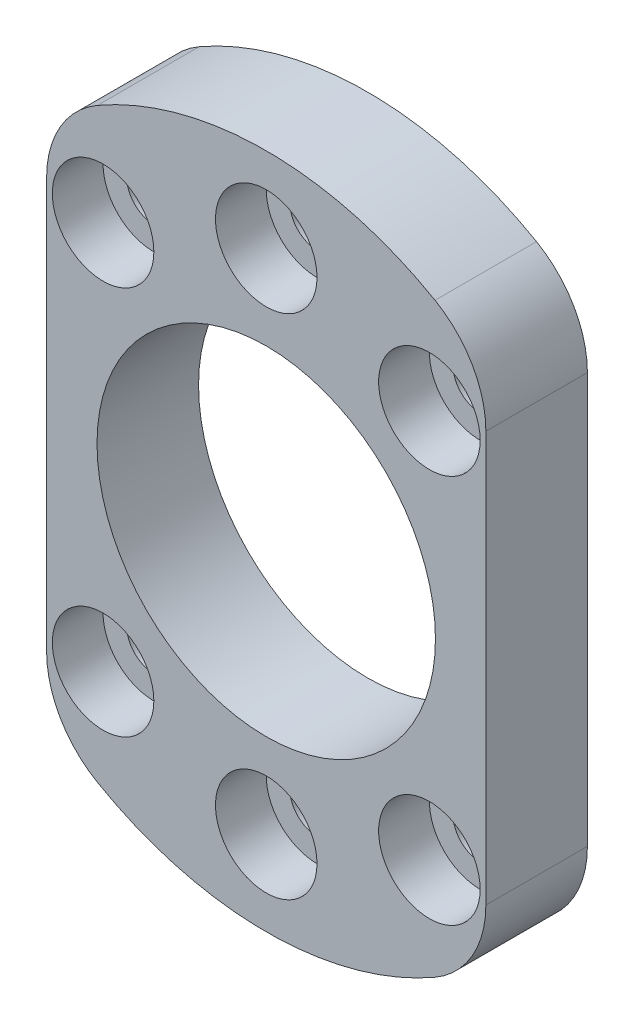
ISO-10303-21;
HEADER;
FILE_DESCRIPTION(('STEP AP214'),'2;1');
FILE_NAME('part.step','',(''),(''),'','','');
FILE_SCHEMA(('AUTOMOTIVE_DESIGN { 1 0 10303 214 1 1 1 1 }'));
ENDSEC;
DATA;
#1=APPLICATION_CONTEXT('core data for automotive mechanical design processes');
#2=APPLICATION_PROTOCOL_DEFINITION('international standard','automotive_design',2000,#1);
#3=PRODUCT_CONTEXT('',#1,'mechanical');
#4=PRODUCT('Part','Part','',(#3));
#5=PRODUCT_RELATED_PRODUCT_CATEGORY('part','',(#4));
#6=PRODUCT_DEFINITION_FORMATION('','',#4);
#7=PRODUCT_DEFINITION_CONTEXT('part definition',#1,'design');
#8=PRODUCT_DEFINITION('design','',#6,#7);
#9=PRODUCT_DEFINITION_SHAPE('','',#8);
#10=(LENGTH_UNIT() NAMED_UNIT(*) SI_UNIT(.MILLI.,.METRE.));
#11=(NAMED_UNIT(*) PLANE_ANGLE_UNIT() SI_UNIT($,.RADIAN.));
#12=(NAMED_UNIT(*) SI_UNIT($,.STERADIAN.) SOLID_ANGLE_UNIT());
#13=UNCERTAINTY_MEASURE_WITH_UNIT(LENGTH_MEASURE(1.E-05),#10,'distance_accuracy_value','');
#14=(GEOMETRIC_REPRESENTATION_CONTEXT(3) GLOBAL_UNCERTAINTY_ASSIGNED_CONTEXT((#13)) GLOBAL_UNIT_ASSIGNED_CONTEXT((#10,
#11,#12)) REPRESENTATION_CONTEXT('',''));
#15=CARTESIAN_POINT('',(0.,0.,0.));
#16=DIRECTION('',(0.,0.,1.));
#17=DIRECTION('',(1.,0.,0.));
#18=AXIS2_PLACEMENT_3D('',#15,#16,#17);
#19=CARTESIAN_POINT('',(9.64181414529811,-11.4906666467846,-1.));
#20=DIRECTION('',(0.,0.,1.));
#21=DIRECTION('',(1.,0.,0.));
#22=AXIS2_PLACEMENT_3D('',#19,#20,#21);
#23=CYLINDRICAL_SURFACE('',#22,1.6);
#24=CARTESIAN_POINT('',(9.64181414529811,-11.4906666467846,0.));
#25=DIRECTION('',(0.,0.,1.));
#26=DIRECTION('',(1.,0.,0.));
#27=AXIS2_PLACEMENT_3D('',#24,#25,#26);
#28=CIRCLE('',#27,1.6);
#29=CARTESIAN_POINT('',(11.2418141452981,-11.4906666467846,0.));
#30=VERTEX_POINT('',#29);
#31=EDGE_CURVE('E156',#30,#30,#28,.T.);
#32=ORIENTED_EDGE('',*,*,#31,.F.);
#33=EDGE_LOOP('',(#32));
#34=FACE_BOUND('',#33,.T.);
#35=CARTESIAN_POINT('',(9.64181414529811,-11.4906666467846,3.));
#36=DIRECTION('',(0.,0.,1.));
#37=DIRECTION('',(1.,0.,0.));
#38=AXIS2_PLACEMENT_3D('',#35,#36,#37);
#39=CIRCLE('',#38,1.6);
#40=CARTESIAN_POINT('',(11.2418141452981,-11.4906666467846,3.));
#41=VERTEX_POINT('',#40);
#42=EDGE_CURVE('E37',#41,#41,#39,.F.);
#43=ORIENTED_EDGE('',*,*,#42,.F.);
#44=EDGE_LOOP('',(#43));
#45=FACE_BOUND('',#44,.T.);
#46=ADVANCED_FACE('F33',(#34,#45),#23,.F.);
#47=CARTESIAN_POINT('',(0.,-15.,-1.));
#48=DIRECTION('',(0.,0.,1.));
#49=DIRECTION('',(1.,0.,0.));
#50=AXIS2_PLACEMENT_3D('',#47,#48,#49);
#51=CYLINDRICAL_SURFACE('',#50,1.6);
#52=CARTESIAN_POINT('',(0.,-15.,0.));
#53=DIRECTION('',(0.,0.,1.));
#54=DIRECTION('',(1.,0.,0.));
#55=AXIS2_PLACEMENT_3D('',#52,#53,#54);
#56=CIRCLE('',#55,1.6);
#57=CARTESIAN_POINT('',(1.6,-15.,0.));
#58=VERTEX_POINT('',#57);
#59=EDGE_CURVE('E153',#58,#58,#56,.T.);
#60=ORIENTED_EDGE('',*,*,#59,.F.);
#61=EDGE_LOOP('',(#60));
#62=FACE_BOUND('',#61,.T.);
#63=CARTESIAN_POINT('',(0.,-15.,3.));
#64=DIRECTION('',(0.,0.,1.));
#65=DIRECTION('',(1.,0.,0.));
#66=AXIS2_PLACEMENT_3D('',#63,#64,#65);
#67=CIRCLE('',#66,1.6);
#68=CARTESIAN_POINT('',(1.6,-15.,3.));
#69=VERTEX_POINT('',#68);
#70=EDGE_CURVE('E204',#69,#69,#67,.F.);
#71=ORIENTED_EDGE('',*,*,#70,.F.);
#72=EDGE_LOOP('',(#71));
#73=FACE_BOUND('',#72,.T.);
#74=ADVANCED_FACE('F260',(#62,#73),#51,.F.);
#75=CARTESIAN_POINT('',(-9.64181414529815,-11.4906666467846,-1.));
#76=DIRECTION('',(0.,0.,1.));
#77=DIRECTION('',(1.,0.,0.));
#78=AXIS2_PLACEMENT_3D('',#75,#76,#77);
#79=CYLINDRICAL_SURFACE('',#78,1.6);
#80=CARTESIAN_POINT('',(-9.64181414529815,-11.4906666467846,0.));
#81=DIRECTION('',(0.,0.,1.));
#82=DIRECTION('',(1.,0.,0.));
#83=AXIS2_PLACEMENT_3D('',#80,#81,#82);
#84=CIRCLE('',#83,1.6);
#85=CARTESIAN_POINT('',(-8.04181414529815,-11.4906666467846,0.));
#86=VERTEX_POINT('',#85);
#87=EDGE_CURVE('E150',#86,#86,#84,.T.);
#88=ORIENTED_EDGE('',*,*,#87,.F.);
#89=EDGE_LOOP('',(#88));
#90=FACE_BOUND('',#89,.T.);
#91=CARTESIAN_POINT('',(-9.64181414529815,-11.4906666467846,3.));
#92=DIRECTION('',(0.,0.,1.));
#93=DIRECTION('',(1.,0.,0.));
#94=AXIS2_PLACEMENT_3D('',#91,#92,#93);
#95=CIRCLE('',#94,1.6);
#96=CARTESIAN_POINT('',(-8.04181414529815,-11.4906666467846,3.));
#97=VERTEX_POINT('',#96);
#98=EDGE_CURVE('E200',#97,#97,#95,.F.);
#99=ORIENTED_EDGE('',*,*,#98,.F.);
#100=EDGE_LOOP('',(#99));
#101=FACE_BOUND('',#100,.T.);
#102=ADVANCED_FACE('F266',(#90,#101),#79,.F.);
#103=CARTESIAN_POINT('',(9.64181414529807,11.4906666467847,-1.));
#104=DIRECTION('',(0.,0.,1.));
#105=DIRECTION('',(1.,0.,0.));
#106=AXIS2_PLACEMENT_3D('',#103,#104,#105);
#107=CYLINDRICAL_SURFACE('',#106,1.6);
#108=CARTESIAN_POINT('',(9.64181414529807,11.4906666467847,0.));
#109=DIRECTION('',(0.,0.,1.));
#110=DIRECTION('',(1.,0.,0.));
#111=AXIS2_PLACEMENT_3D('',#108,#109,#110);
#112=CIRCLE('',#111,1.6);
#113=CARTESIAN_POINT('',(11.2418141452981,11.4906666467847,0.));
#114=VERTEX_POINT('',#113);
#115=EDGE_CURVE('E147',#114,#114,#112,.T.);
#116=ORIENTED_EDGE('',*,*,#115,.F.);
#117=EDGE_LOOP('',(#116));
#118=FACE_BOUND('',#117,.T.);
#119=CARTESIAN_POINT('',(9.64181414529807,11.4906666467847,3.));
#120=DIRECTION('',(0.,0.,1.));
#121=DIRECTION('',(1.,0.,0.));
#122=AXIS2_PLACEMENT_3D('',#119,#120,#121);
#123=CIRCLE('',#122,1.6);
#124=CARTESIAN_POINT('',(11.2418141452981,11.4906666467847,3.));
#125=VERTEX_POINT('',#124);
#126=EDGE_CURVE('E195',#125,#125,#123,.F.);
#127=ORIENTED_EDGE('',*,*,#126,.F.);
#128=EDGE_LOOP('',(#127));
#129=FACE_BOUND('',#128,.T.);
#130=ADVANCED_FACE('F276',(#118,#129),#107,.F.);
#131=CARTESIAN_POINT('',(0.,15.,-1.));
#132=DIRECTION('',(0.,0.,1.));
#133=DIRECTION('',(1.,0.,0.));
#134=AXIS2_PLACEMENT_3D('',#131,#132,#133);
#135=CYLINDRICAL_SURFACE('',#134,1.6);
#136=CARTESIAN_POINT('',(0.,15.,0.));
#137=DIRECTION('',(0.,0.,1.));
#138=DIRECTION('',(1.,0.,0.));
#139=AXIS2_PLACEMENT_3D('',#136,#137,#138);
#140=CIRCLE('',#139,1.6);
#141=CARTESIAN_POINT('',(1.6,15.,0.));
#142=VERTEX_POINT('',#141);
#143=EDGE_CURVE('E144',#142,#142,#140,.T.);
#144=ORIENTED_EDGE('',*,*,#143,.F.);
#145=EDGE_LOOP('',(#144));
#146=FACE_BOUND('',#145,.T.);
#147=CARTESIAN_POINT('',(0.,15.,3.));
#148=DIRECTION('',(0.,0.,1.));
#149=DIRECTION('',(1.,0.,0.));
#150=AXIS2_PLACEMENT_3D('',#147,#148,#149);
#151=CIRCLE('',#150,1.6);
#152=CARTESIAN_POINT('',(1.6,15.,3.));
#153=VERTEX_POINT('',#152);
#154=EDGE_CURVE('E190',#153,#153,#151,.F.);
#155=ORIENTED_EDGE('',*,*,#154,.F.);
#156=EDGE_LOOP('',(#155));
#157=FACE_BOUND('',#156,.T.);
#158=ADVANCED_FACE('F253',(#146,#157),#135,.F.);
#159=CARTESIAN_POINT('',(-9.64181414529811,11.4906666467846,-1.));
#160=DIRECTION('',(0.,0.,1.));
#161=DIRECTION('',(1.,0.,0.));
#162=AXIS2_PLACEMENT_3D('',#159,#160,#161);
#163=CYLINDRICAL_SURFACE('',#162,1.6);
#164=CARTESIAN_POINT('',(-9.64181414529811,11.4906666467846,0.));
#165=DIRECTION('',(0.,0.,1.));
#166=DIRECTION('',(1.,0.,0.));
#167=AXIS2_PLACEMENT_3D('',#164,#165,#166);
#168=CIRCLE('',#167,1.6);
#169=CARTESIAN_POINT('',(-8.04181414529811,11.4906666467846,0.));
#170=VERTEX_POINT('',#169);
#171=EDGE_CURVE('E140',#170,#170,#168,.T.);
#172=ORIENTED_EDGE('',*,*,#171,.F.);
#173=EDGE_LOOP('',(#172));
#174=FACE_BOUND('',#173,.T.);
#175=CARTESIAN_POINT('',(-9.64181414529811,11.4906666467846,3.));
#176=DIRECTION('',(0.,0.,1.));
#177=DIRECTION('',(1.,0.,0.));
#178=AXIS2_PLACEMENT_3D('',#175,#176,#177);
#179=CIRCLE('',#178,1.6);
#180=CARTESIAN_POINT('',(-8.04181414529811,11.4906666467846,3.));
#181=VERTEX_POINT('',#180);
#182=EDGE_CURVE('E158',#181,#181,#179,.F.);
#183=ORIENTED_EDGE('',*,*,#182,.F.);
#184=EDGE_LOOP('',(#183));
#185=FACE_BOUND('',#184,.T.);
#186=ADVANCED_FACE('F244',(#174,#185),#163,.F.);
#187=CARTESIAN_POINT('',(0.,0.,6.));
#188=DIRECTION('',(0.,0.,1.));
#189=DIRECTION('',(1.,0.,0.));
#190=AXIS2_PLACEMENT_3D('',#187,#188,#189);
#191=PLANE('',#190);
#192=CARTESIAN_POINT('',(9.64181414529811,-11.4906666467846,6.));
#193=DIRECTION('',(0.,0.,1.));
#194=DIRECTION('',(1.,0.,0.));
#195=AXIS2_PLACEMENT_3D('',#192,#193,#194);
#196=CIRCLE('',#195,3.);
#197=CARTESIAN_POINT('',(12.6418141452981,-11.4906666467846,6.));
#198=VERTEX_POINT('',#197);
#199=EDGE_CURVE('E381',#198,#198,#196,.T.);
#200=ORIENTED_EDGE('',*,*,#199,.F.);
#201=EDGE_LOOP('',(#200));
#202=FACE_BOUND('',#201,.T.);
#203=CARTESIAN_POINT('',(0.,-15.,6.));
#204=DIRECTION('',(0.,0.,1.));
#205=DIRECTION('',(1.,0.,0.));
#206=AXIS2_PLACEMENT_3D('',#203,#204,#205);
#207=CIRCLE('',#206,3.);
#208=CARTESIAN_POINT('',(3.,-15.,6.));
#209=VERTEX_POINT('',#208);
#210=EDGE_CURVE('E213',#209,#209,#207,.T.);
#211=ORIENTED_EDGE('',*,*,#210,.F.);
#212=EDGE_LOOP('',(#211));
#213=FACE_BOUND('',#212,.T.);
#214=CARTESIAN_POINT('',(-9.64181414529815,-11.4906666467846,6.));
#215=DIRECTION('',(0.,0.,1.));
#216=DIRECTION('',(1.,0.,0.));
#217=AXIS2_PLACEMENT_3D('',#214,#215,#216);
#218=CIRCLE('',#217,3.);
#219=CARTESIAN_POINT('',(-6.64181414529815,-11.4906666467846,6.));
#220=VERTEX_POINT('',#219);
#221=EDGE_CURVE('E206',#220,#220,#218,.T.);
#222=ORIENTED_EDGE('',*,*,#221,.F.);
#223=EDGE_LOOP('',(#222));
#224=FACE_BOUND('',#223,.T.);
#225=CARTESIAN_POINT('',(9.64181414529807,11.4906666467847,6.));
#226=DIRECTION('',(0.,0.,1.));
#227=DIRECTION('',(1.,0.,0.));
#228=AXIS2_PLACEMENT_3D('',#225,#226,#227);
#229=CIRCLE('',#228,3.);
#230=CARTESIAN_POINT('',(12.6418141452981,11.4906666467847,6.));
#231=VERTEX_POINT('',#230);
#232=EDGE_CURVE('E202',#231,#231,#229,.T.);
#233=ORIENTED_EDGE('',*,*,#232,.F.);
#234=EDGE_LOOP('',(#233));
#235=FACE_BOUND('',#234,.T.);
#236=CARTESIAN_POINT('',(0.,15.,6.));
#237=DIRECTION('',(0.,0.,1.));
#238=DIRECTION('',(1.,0.,0.));
#239=AXIS2_PLACEMENT_3D('',#236,#237,#238);
#240=CIRCLE('',#239,3.);
#241=CARTESIAN_POINT('',(3.,15.,6.));
#242=VERTEX_POINT('',#241);
#243=EDGE_CURVE('E198',#242,#242,#240,.T.);
#244=ORIENTED_EDGE('',*,*,#243,.F.);
#245=EDGE_LOOP('',(#244));
#246=FACE_BOUND('',#245,.T.);
#247=CARTESIAN_POINT('',(-9.64181414529811,11.4906666467846,6.));
#248=DIRECTION('',(0.,0.,1.));
#249=DIRECTION('',(1.,0.,0.));
#250=AXIS2_PLACEMENT_3D('',#247,#248,#249);
#251=CIRCLE('',#250,3.);
#252=CARTESIAN_POINT('',(-6.64181414529811,11.4906666467846,6.));
#253=VERTEX_POINT('',#252);
#254=EDGE_CURVE('E193',#253,#253,#251,.T.);
#255=ORIENTED_EDGE('',*,*,#254,.F.);
#256=EDGE_LOOP('',(#255));
#257=FACE_BOUND('',#256,.T.);
#258=CARTESIAN_POINT('',(0.,0.,6.));
#259=DIRECTION('',(0.,0.,1.));
#260=DIRECTION('',(1.,0.,0.));
#261=AXIS2_PLACEMENT_3D('',#258,#259,#260);
#262=CIRCLE('',#261,19.99);
#263=CARTESIAN_POINT('',(-9.97356683345246,-17.3242045883399,6.));
#264=VERTEX_POINT('',#263);
#265=CARTESIAN_POINT('',(9.97356683345247,-17.3242045883399,6.));
#266=VERTEX_POINT('',#265);
#267=EDGE_CURVE('E137',#264,#266,#262,.T.);
#268=ORIENTED_EDGE('',*,*,#267,.T.);
#269=CARTESIAN_POINT('',(6.98,-12.1243432811843,6.));
#270=DIRECTION('',(0.,0.,1.));
#271=DIRECTION('',(1.,0.,0.));
#272=AXIS2_PLACEMENT_3D('',#269,#270,#271);
#273=CIRCLE('',#272,6.);
#274=CARTESIAN_POINT('',(12.98,-12.1243432811843,6.));
#275=VERTEX_POINT('',#274);
#276=EDGE_CURVE('E11',#266,#275,#273,.T.);
#277=ORIENTED_EDGE('',*,*,#276,.T.);
#278=DIRECTION('',(0.,1.,0.));
#279=VECTOR('',#278,1.);
#280=CARTESIAN_POINT('',(12.98,-15.2026214844677,6.));
#281=LINE('',#280,#279);
#282=CARTESIAN_POINT('',(12.98,12.1243432811843,6.));
#283=VERTEX_POINT('',#282);
#284=EDGE_CURVE('E119',#275,#283,#281,.T.);
#285=ORIENTED_EDGE('',*,*,#284,.T.);
#286=CARTESIAN_POINT('',(6.98,12.1243432811843,6.));
#287=DIRECTION('',(0.,0.,1.));
#288=DIRECTION('',(1.,0.,0.));
#289=AXIS2_PLACEMENT_3D('',#286,#287,#288);
#290=CIRCLE('',#289,6.);
#291=CARTESIAN_POINT('',(9.97356683345247,17.3242045883399,6.));
#292=VERTEX_POINT('',#291);
#293=EDGE_CURVE('E172',#283,#292,#290,.T.);
#294=ORIENTED_EDGE('',*,*,#293,.T.);
#295=CARTESIAN_POINT('',(0.,0.,6.));
#296=DIRECTION('',(0.,0.,1.));
#297=DIRECTION('',(1.,0.,0.));
#298=AXIS2_PLACEMENT_3D('',#295,#296,#297);
#299=CIRCLE('',#298,19.99);
#300=CARTESIAN_POINT('',(-9.97356683345246,17.3242045883399,6.));
#301=VERTEX_POINT('',#300);
#302=EDGE_CURVE('E134',#292,#301,#299,.T.);
#303=ORIENTED_EDGE('',*,*,#302,.T.);
#304=CARTESIAN_POINT('',(-6.98,12.1243432811843,6.));
#305=DIRECTION('',(0.,0.,1.));
#306=DIRECTION('',(1.,0.,0.));
#307=AXIS2_PLACEMENT_3D('',#304,#305,#306);
#308=CIRCLE('',#307,6.);
#309=CARTESIAN_POINT('',(-12.98,12.1243432811843,6.));
#310=VERTEX_POINT('',#309);
#311=EDGE_CURVE('E161',#301,#310,#308,.T.);
#312=ORIENTED_EDGE('',*,*,#311,.T.);
#313=DIRECTION('',(0.,-1.,0.));
#314=VECTOR('',#313,1.);
#315=CARTESIAN_POINT('',(-12.98,15.2026214844677,6.));
#316=LINE('',#315,#314);
#317=CARTESIAN_POINT('',(-12.98,-12.1243432811843,6.));
#318=VERTEX_POINT('',#317);
#319=EDGE_CURVE('E118',#310,#318,#316,.T.);
#320=ORIENTED_EDGE('',*,*,#319,.T.);
#321=CARTESIAN_POINT('',(-6.98,-12.1243432811843,6.));
#322=DIRECTION('',(0.,0.,1.));
#323=DIRECTION('',(1.,0.,0.));
#324=AXIS2_PLACEMENT_3D('',#321,#322,#323);
#325=CIRCLE('',#324,6.);
#326=EDGE_CURVE('E180',#318,#264,#325,.T.);
#327=ORIENTED_EDGE('',*,*,#326,.T.);
#328=EDGE_LOOP('',(#268,#277,#285,#294,#303,#312,#320,#327));
#329=FACE_BOUND('',#328,.T.);
#330=CARTESIAN_POINT('',(0.,0.,6.));
#331=DIRECTION('',(0.,0.,1.));
#332=DIRECTION('',(1.,0.,0.));
#333=AXIS2_PLACEMENT_3D('',#330,#331,#332);
#334=CIRCLE('',#333,10.);
#335=CARTESIAN_POINT('',(10.,0.,6.));
#336=VERTEX_POINT('',#335);
#337=EDGE_CURVE('E129',#336,#336,#334,.T.);
#338=ORIENTED_EDGE('',*,*,#337,.F.);
#339=EDGE_LOOP('',(#338));
#340=FACE_BOUND('',#339,.T.);
#341=ADVANCED_FACE('F242',(#202,#213,#224,#235,#246,#257,#329,#340),#191,.T.);
#342=CARTESIAN_POINT('',(0.,0.,0.));
#343=DIRECTION('',(0.,0.,1.));
#344=DIRECTION('',(1.,0.,0.));
#345=AXIS2_PLACEMENT_3D('',#342,#343,#344);
#346=PLANE('',#345);
#347=ORIENTED_EDGE('',*,*,#31,.T.);
#348=EDGE_LOOP('',(#347));
#349=FACE_BOUND('',#348,.T.);
#350=ORIENTED_EDGE('',*,*,#59,.T.);
#351=EDGE_LOOP('',(#350));
#352=FACE_BOUND('',#351,.T.);
#353=ORIENTED_EDGE('',*,*,#87,.T.);
#354=EDGE_LOOP('',(#353));
#355=FACE_BOUND('',#354,.T.);
#356=ORIENTED_EDGE('',*,*,#115,.T.);
#357=EDGE_LOOP('',(#356));
#358=FACE_BOUND('',#357,.T.);
#359=ORIENTED_EDGE('',*,*,#143,.T.);
#360=EDGE_LOOP('',(#359));
#361=FACE_BOUND('',#360,.T.);
#362=ORIENTED_EDGE('',*,*,#171,.T.);
#363=EDGE_LOOP('',(#362));
#364=FACE_BOUND('',#363,.T.);
#365=DIRECTION('',(0.,1.,0.));
#366=VECTOR('',#365,1.);
#367=CARTESIAN_POINT('',(12.98,-15.2026214844677,0.));
#368=LINE('',#367,#366);
#369=CARTESIAN_POINT('',(12.98,-12.1243432811843,0.));
#370=VERTEX_POINT('',#369);
#371=CARTESIAN_POINT('',(12.98,12.1243432811843,0.));
#372=VERTEX_POINT('',#371);
#373=EDGE_CURVE('E127',#370,#372,#368,.T.);
#374=ORIENTED_EDGE('',*,*,#373,.F.);
#375=CARTESIAN_POINT('',(6.98,-12.1243432811843,0.));
#376=DIRECTION('',(0.,0.,1.));
#377=DIRECTION('',(1.,0.,0.));
#378=AXIS2_PLACEMENT_3D('',#375,#376,#377);
#379=CIRCLE('',#378,6.);
#380=CARTESIAN_POINT('',(9.97356683345247,-17.3242045883399,0.));
#381=VERTEX_POINT('',#380);
#382=EDGE_CURVE('E57',#370,#381,#379,.F.);
#383=ORIENTED_EDGE('',*,*,#382,.T.);
#384=CARTESIAN_POINT('',(0.,0.,0.));
#385=DIRECTION('',(0.,0.,1.));
#386=DIRECTION('',(1.,0.,0.));
#387=AXIS2_PLACEMENT_3D('',#384,#385,#386);
#388=CIRCLE('',#387,19.99);
#389=CARTESIAN_POINT('',(-9.97356683345246,-17.3242045883399,0.));
#390=VERTEX_POINT('',#389);
#391=EDGE_CURVE('E124',#390,#381,#388,.T.);
#392=ORIENTED_EDGE('',*,*,#391,.F.);
#393=CARTESIAN_POINT('',(-6.98,-12.1243432811843,0.));
#394=DIRECTION('',(0.,0.,1.));
#395=DIRECTION('',(1.,0.,0.));
#396=AXIS2_PLACEMENT_3D('',#393,#394,#395);
#397=CIRCLE('',#396,6.);
#398=CARTESIAN_POINT('',(-12.98,-12.1243432811843,0.));
#399=VERTEX_POINT('',#398);
#400=EDGE_CURVE('E123',#390,#399,#397,.F.);
#401=ORIENTED_EDGE('',*,*,#400,.T.);
#402=DIRECTION('',(0.,-1.,0.));
#403=VECTOR('',#402,1.);
#404=CARTESIAN_POINT('',(-12.98,15.2026214844677,0.));
#405=LINE('',#404,#403);
#406=CARTESIAN_POINT('',(-12.98,12.1243432811843,0.));
#407=VERTEX_POINT('',#406);
#408=EDGE_CURVE('E115',#407,#399,#405,.T.);
#409=ORIENTED_EDGE('',*,*,#408,.F.);
#410=CARTESIAN_POINT('',(-6.98,12.1243432811843,0.));
#411=DIRECTION('',(0.,0.,1.));
#412=DIRECTION('',(1.,0.,0.));
#413=AXIS2_PLACEMENT_3D('',#410,#411,#412);
#414=CIRCLE('',#413,6.);
#415=CARTESIAN_POINT('',(-9.97356683345246,17.3242045883399,0.));
#416=VERTEX_POINT('',#415);
#417=EDGE_CURVE('E101',#407,#416,#414,.F.);
#418=ORIENTED_EDGE('',*,*,#417,.T.);
#419=CARTESIAN_POINT('',(0.,0.,0.));
#420=DIRECTION('',(0.,0.,1.));
#421=DIRECTION('',(1.,0.,0.));
#422=AXIS2_PLACEMENT_3D('',#419,#420,#421);
#423=CIRCLE('',#422,19.99);
#424=CARTESIAN_POINT('',(9.97356683345247,17.3242045883399,0.));
#425=VERTEX_POINT('',#424);
#426=EDGE_CURVE('E125',#425,#416,#423,.T.);
#427=ORIENTED_EDGE('',*,*,#426,.F.);
#428=CARTESIAN_POINT('',(6.98,12.1243432811843,0.));
#429=DIRECTION('',(0.,0.,1.));
#430=DIRECTION('',(1.,0.,0.));
#431=AXIS2_PLACEMENT_3D('',#428,#429,#430);
#432=CIRCLE('',#431,6.);
#433=EDGE_CURVE('E166',#425,#372,#432,.F.);
#434=ORIENTED_EDGE('',*,*,#433,.T.);
#435=EDGE_LOOP('',(#374,#383,#392,#401,#409,#418,#427,#434));
#436=FACE_BOUND('',#435,.T.);
#437=CARTESIAN_POINT('',(0.,0.,0.));
#438=DIRECTION('',(0.,0.,1.));
#439=DIRECTION('',(1.,0.,0.));
#440=AXIS2_PLACEMENT_3D('',#437,#438,#439);
#441=CIRCLE('',#440,10.);
#442=CARTESIAN_POINT('',(10.,0.,0.));
#443=VERTEX_POINT('',#442);
#444=EDGE_CURVE('E143',#443,#443,#441,.T.);
#445=ORIENTED_EDGE('',*,*,#444,.T.);
#446=EDGE_LOOP('',(#445));
#447=FACE_BOUND('',#446,.T.);
#448=ADVANCED_FACE('F121',(#349,#352,#355,#358,#361,#364,#436,#447),#346,.F.);
#449=CARTESIAN_POINT('',(0.,0.,6.));
#450=DIRECTION('',(0.,0.,-1.));
#451=DIRECTION('',(-1.,0.,0.));
#452=AXIS2_PLACEMENT_3D('',#449,#450,#451);
#453=CYLINDRICAL_SURFACE('',#452,19.99);
#454=ORIENTED_EDGE('',*,*,#302,.F.);
#455=DIRECTION('',(0.,0.,-1.));
#456=VECTOR('',#455,1.);
#457=CARTESIAN_POINT('',(9.97356683345247,17.3242045883399,6.));
#458=LINE('',#457,#456);
#459=EDGE_CURVE('E163',#292,#425,#458,.T.);
#460=ORIENTED_EDGE('',*,*,#459,.T.);
#461=ORIENTED_EDGE('',*,*,#426,.T.);
#462=DIRECTION('',(0.,0.,-1.));
#463=VECTOR('',#462,1.);
#464=CARTESIAN_POINT('',(-9.97356683345247,17.3242045883399,6.));
#465=LINE('',#464,#463);
#466=EDGE_CURVE('E107',#416,#301,#465,.F.);
#467=ORIENTED_EDGE('',*,*,#466,.T.);
#468=EDGE_LOOP('',(#454,#460,#461,#467));
#469=FACE_BOUND('',#468,.T.);
#470=ADVANCED_FACE('F35',(#469),#453,.T.);
#471=CARTESIAN_POINT('',(-12.98,15.2026214844677,6.));
#472=DIRECTION('',(1.,0.,0.));
#473=DIRECTION('',(0.,0.,-1.));
#474=AXIS2_PLACEMENT_3D('',#471,#472,#473);
#475=PLANE('',#474);
#476=ORIENTED_EDGE('',*,*,#408,.T.);
#477=DIRECTION('',(0.,0.,-1.));
#478=VECTOR('',#477,1.);
#479=CARTESIAN_POINT('',(-12.98,-12.1243432811843,6.));
#480=LINE('',#479,#478);
#481=EDGE_CURVE('E178',#399,#318,#480,.F.);
#482=ORIENTED_EDGE('',*,*,#481,.T.);
#483=ORIENTED_EDGE('',*,*,#319,.F.);
#484=DIRECTION('',(0.,0.,-1.));
#485=VECTOR('',#484,1.);
#486=CARTESIAN_POINT('',(-12.98,12.1243432811843,6.));
#487=LINE('',#486,#485);
#488=EDGE_CURVE('E105',#310,#407,#487,.T.);
#489=ORIENTED_EDGE('',*,*,#488,.T.);
#490=EDGE_LOOP('',(#476,#482,#483,#489));
#491=FACE_BOUND('',#490,.T.);
#492=ADVANCED_FACE('F114',(#491),#475,.F.);
#493=CARTESIAN_POINT('',(0.,0.,6.));
#494=DIRECTION('',(0.,0.,-1.));
#495=DIRECTION('',(-1.,0.,0.));
#496=AXIS2_PLACEMENT_3D('',#493,#494,#495);
#497=CYLINDRICAL_SURFACE('',#496,19.99);
#498=ORIENTED_EDGE('',*,*,#391,.T.);
#499=DIRECTION('',(0.,0.,-1.));
#500=VECTOR('',#499,1.);
#501=CARTESIAN_POINT('',(9.97356683345247,-17.3242045883399,6.));
#502=LINE('',#501,#500);
#503=EDGE_CURVE('E42',#381,#266,#502,.F.);
#504=ORIENTED_EDGE('',*,*,#503,.T.);
#505=ORIENTED_EDGE('',*,*,#267,.F.);
#506=DIRECTION('',(0.,0.,-1.));
#507=VECTOR('',#506,1.);
#508=CARTESIAN_POINT('',(-9.97356683345247,-17.3242045883399,6.));
#509=LINE('',#508,#507);
#510=EDGE_CURVE('E174',#264,#390,#509,.T.);
#511=ORIENTED_EDGE('',*,*,#510,.T.);
#512=EDGE_LOOP('',(#498,#504,#505,#511));
#513=FACE_BOUND('',#512,.T.);
#514=ADVANCED_FACE('F291',(#513),#497,.T.);
#515=CARTESIAN_POINT('',(12.98,-15.2026214844677,6.));
#516=DIRECTION('',(-1.,0.,0.));
#517=DIRECTION('',(0.,0.,1.));
#518=AXIS2_PLACEMENT_3D('',#515,#516,#517);
#519=PLANE('',#518);
#520=ORIENTED_EDGE('',*,*,#284,.F.);
#521=DIRECTION('',(0.,0.,-1.));
#522=VECTOR('',#521,1.);
#523=CARTESIAN_POINT('',(12.98,-12.1243432811843,6.));
#524=LINE('',#523,#522);
#525=EDGE_CURVE('E182',#275,#370,#524,.T.);
#526=ORIENTED_EDGE('',*,*,#525,.T.);
#527=ORIENTED_EDGE('',*,*,#373,.T.);
#528=DIRECTION('',(0.,0.,-1.));
#529=VECTOR('',#528,1.);
#530=CARTESIAN_POINT('',(12.98,12.1243432811843,6.));
#531=LINE('',#530,#529);
#532=EDGE_CURVE('E169',#372,#283,#531,.F.);
#533=ORIENTED_EDGE('',*,*,#532,.T.);
#534=EDGE_LOOP('',(#520,#526,#527,#533));
#535=FACE_BOUND('',#534,.T.);
#536=ADVANCED_FACE('F285',(#535),#519,.F.);
#537=CARTESIAN_POINT('',(0.,0.,6.));
#538=DIRECTION('',(0.,0.,-1.));
#539=DIRECTION('',(-1.,0.,0.));
#540=AXIS2_PLACEMENT_3D('',#537,#538,#539);
#541=CYLINDRICAL_SURFACE('',#540,10.);
#542=ORIENTED_EDGE('',*,*,#337,.T.);
#543=EDGE_LOOP('',(#542));
#544=FACE_BOUND('',#543,.T.);
#545=ORIENTED_EDGE('',*,*,#444,.F.);
#546=EDGE_LOOP('',(#545));
#547=FACE_BOUND('',#546,.T.);
#548=ADVANCED_FACE('F239',(#544,#547),#541,.F.);
#549=CARTESIAN_POINT('',(-6.98,12.1243432811843,6.));
#550=DIRECTION('',(0.,0.,-1.));
#551=DIRECTION('',(-1.,0.,0.));
#552=AXIS2_PLACEMENT_3D('',#549,#550,#551);
#553=CYLINDRICAL_SURFACE('',#552,6.);
#554=ORIENTED_EDGE('',*,*,#311,.F.);
#555=ORIENTED_EDGE('',*,*,#466,.F.);
#556=ORIENTED_EDGE('',*,*,#417,.F.);
#557=ORIENTED_EDGE('',*,*,#488,.F.);
#558=EDGE_LOOP('',(#554,#555,#556,#557));
#559=FACE_BOUND('',#558,.T.);
#560=ADVANCED_FACE('F104',(#559),#553,.T.);
#561=CARTESIAN_POINT('',(6.98,12.1243432811843,6.));
#562=DIRECTION('',(0.,0.,-1.));
#563=DIRECTION('',(-1.,0.,0.));
#564=AXIS2_PLACEMENT_3D('',#561,#562,#563);
#565=CYLINDRICAL_SURFACE('',#564,6.);
#566=ORIENTED_EDGE('',*,*,#293,.F.);
#567=ORIENTED_EDGE('',*,*,#532,.F.);
#568=ORIENTED_EDGE('',*,*,#433,.F.);
#569=ORIENTED_EDGE('',*,*,#459,.F.);
#570=EDGE_LOOP('',(#566,#567,#568,#569));
#571=FACE_BOUND('',#570,.T.);
#572=ADVANCED_FACE('F290',(#571),#565,.T.);
#573=CARTESIAN_POINT('',(-6.98,-12.1243432811843,6.));
#574=DIRECTION('',(0.,0.,-1.));
#575=DIRECTION('',(-1.,0.,0.));
#576=AXIS2_PLACEMENT_3D('',#573,#574,#575);
#577=CYLINDRICAL_SURFACE('',#576,6.);
#578=ORIENTED_EDGE('',*,*,#326,.F.);
#579=ORIENTED_EDGE('',*,*,#481,.F.);
#580=ORIENTED_EDGE('',*,*,#400,.F.);
#581=ORIENTED_EDGE('',*,*,#510,.F.);
#582=EDGE_LOOP('',(#578,#579,#580,#581));
#583=FACE_BOUND('',#582,.T.);
#584=ADVANCED_FACE('F318',(#583),#577,.T.);
#585=CARTESIAN_POINT('',(6.98,-12.1243432811843,6.));
#586=DIRECTION('',(0.,0.,-1.));
#587=DIRECTION('',(-1.,0.,0.));
#588=AXIS2_PLACEMENT_3D('',#585,#586,#587);
#589=CYLINDRICAL_SURFACE('',#588,6.);
#590=ORIENTED_EDGE('',*,*,#276,.F.);
#591=ORIENTED_EDGE('',*,*,#503,.F.);
#592=ORIENTED_EDGE('',*,*,#382,.F.);
#593=ORIENTED_EDGE('',*,*,#525,.F.);
#594=EDGE_LOOP('',(#590,#591,#592,#593));
#595=FACE_BOUND('',#594,.T.);
#596=ADVANCED_FACE('F314',(#595),#589,.T.);
#597=CARTESIAN_POINT('',(-9.64181414529811,11.4906666467846,3.));
#598=DIRECTION('',(0.,0.,1.));
#599=DIRECTION('',(1.,0.,0.));
#600=AXIS2_PLACEMENT_3D('',#597,#598,#599);
#601=PLANE('',#600);
#602=CARTESIAN_POINT('',(-9.64181414529811,11.4906666467846,3.));
#603=DIRECTION('',(0.,0.,1.));
#604=DIRECTION('',(1.,0.,0.));
#605=AXIS2_PLACEMENT_3D('',#602,#603,#604);
#606=CIRCLE('',#605,3.);
#607=CARTESIAN_POINT('',(-6.64181414529811,11.4906666467846,3.));
#608=VERTEX_POINT('',#607);
#609=EDGE_CURVE('E189',#608,#608,#606,.T.);
#610=ORIENTED_EDGE('',*,*,#609,.T.);
#611=EDGE_LOOP('',(#610));
#612=FACE_BOUND('',#611,.T.);
#613=ORIENTED_EDGE('',*,*,#182,.T.);
#614=EDGE_LOOP('',(#613));
#615=FACE_BOUND('',#614,.T.);
#616=ADVANCED_FACE('F325',(#612,#615),#601,.T.);
#617=CARTESIAN_POINT('',(-9.64181414529811,11.4906666467846,3.));
#618=DIRECTION('',(0.,0.,1.));
#619=DIRECTION('',(1.,0.,0.));
#620=AXIS2_PLACEMENT_3D('',#617,#618,#619);
#621=CYLINDRICAL_SURFACE('',#620,3.);
#622=ORIENTED_EDGE('',*,*,#609,.F.);
#623=EDGE_LOOP('',(#622));
#624=FACE_BOUND('',#623,.T.);
#625=ORIENTED_EDGE('',*,*,#254,.T.);
#626=EDGE_LOOP('',(#625));
#627=FACE_BOUND('',#626,.T.);
#628=ADVANCED_FACE('F328',(#624,#627),#621,.F.);
#629=CARTESIAN_POINT('',(0.,15.,3.));
#630=DIRECTION('',(0.,0.,1.));
#631=DIRECTION('',(1.,0.,0.));
#632=AXIS2_PLACEMENT_3D('',#629,#630,#631);
#633=PLANE('',#632);
#634=CARTESIAN_POINT('',(0.,15.,3.));
#635=DIRECTION('',(0.,0.,1.));
#636=DIRECTION('',(1.,0.,0.));
#637=AXIS2_PLACEMENT_3D('',#634,#635,#636);
#638=CIRCLE('',#637,3.);
#639=CARTESIAN_POINT('',(3.,15.,3.));
#640=VERTEX_POINT('',#639);
#641=EDGE_CURVE('E194',#640,#640,#638,.T.);
#642=ORIENTED_EDGE('',*,*,#641,.T.);
#643=EDGE_LOOP('',(#642));
#644=FACE_BOUND('',#643,.T.);
#645=ORIENTED_EDGE('',*,*,#154,.T.);
#646=EDGE_LOOP('',(#645));
#647=FACE_BOUND('',#646,.T.);
#648=ADVANCED_FACE('F331',(#644,#647),#633,.T.);
#649=CARTESIAN_POINT('',(0.,15.,3.));
#650=DIRECTION('',(0.,0.,1.));
#651=DIRECTION('',(1.,0.,0.));
#652=AXIS2_PLACEMENT_3D('',#649,#650,#651);
#653=CYLINDRICAL_SURFACE('',#652,3.);
#654=ORIENTED_EDGE('',*,*,#641,.F.);
#655=EDGE_LOOP('',(#654));
#656=FACE_BOUND('',#655,.T.);
#657=ORIENTED_EDGE('',*,*,#243,.T.);
#658=EDGE_LOOP('',(#657));
#659=FACE_BOUND('',#658,.T.);
#660=ADVANCED_FACE('F336',(#656,#659),#653,.F.);
#661=CARTESIAN_POINT('',(9.64181414529807,11.4906666467847,3.));
#662=DIRECTION('',(0.,0.,1.));
#663=DIRECTION('',(1.,0.,0.));
#664=AXIS2_PLACEMENT_3D('',#661,#662,#663);
#665=PLANE('',#664);
#666=CARTESIAN_POINT('',(9.64181414529807,11.4906666467847,3.));
#667=DIRECTION('',(0.,0.,1.));
#668=DIRECTION('',(1.,0.,0.));
#669=AXIS2_PLACEMENT_3D('',#666,#667,#668);
#670=CIRCLE('',#669,3.);
#671=CARTESIAN_POINT('',(12.6418141452981,11.4906666467847,3.));
#672=VERTEX_POINT('',#671);
#673=EDGE_CURVE('E199',#672,#672,#670,.T.);
#674=ORIENTED_EDGE('',*,*,#673,.T.);
#675=EDGE_LOOP('',(#674));
#676=FACE_BOUND('',#675,.T.);
#677=ORIENTED_EDGE('',*,*,#126,.T.);
#678=EDGE_LOOP('',(#677));
#679=FACE_BOUND('',#678,.T.);
#680=ADVANCED_FACE('F339',(#676,#679),#665,.T.);
#681=CARTESIAN_POINT('',(9.64181414529807,11.4906666467847,3.));
#682=DIRECTION('',(0.,0.,1.));
#683=DIRECTION('',(1.,0.,0.));
#684=AXIS2_PLACEMENT_3D('',#681,#682,#683);
#685=CYLINDRICAL_SURFACE('',#684,3.);
#686=ORIENTED_EDGE('',*,*,#673,.F.);
#687=EDGE_LOOP('',(#686));
#688=FACE_BOUND('',#687,.T.);
#689=ORIENTED_EDGE('',*,*,#232,.T.);
#690=EDGE_LOOP('',(#689));
#691=FACE_BOUND('',#690,.T.);
#692=ADVANCED_FACE('F344',(#688,#691),#685,.F.);
#693=CARTESIAN_POINT('',(-9.64181414529815,-11.4906666467846,3.));
#694=DIRECTION('',(0.,0.,1.));
#695=DIRECTION('',(1.,0.,0.));
#696=AXIS2_PLACEMENT_3D('',#693,#694,#695);
#697=PLANE('',#696);
#698=CARTESIAN_POINT('',(-9.64181414529815,-11.4906666467846,3.));
#699=DIRECTION('',(0.,0.,1.));
#700=DIRECTION('',(1.,0.,0.));
#701=AXIS2_PLACEMENT_3D('',#698,#699,#700);
#702=CIRCLE('',#701,3.);
#703=CARTESIAN_POINT('',(-6.64181414529815,-11.4906666467846,3.));
#704=VERTEX_POINT('',#703);
#705=EDGE_CURVE('E203',#704,#704,#702,.T.);
#706=ORIENTED_EDGE('',*,*,#705,.T.);
#707=EDGE_LOOP('',(#706));
#708=FACE_BOUND('',#707,.T.);
#709=ORIENTED_EDGE('',*,*,#98,.T.);
#710=EDGE_LOOP('',(#709));
#711=FACE_BOUND('',#710,.T.);
#712=ADVANCED_FACE('F347',(#708,#711),#697,.T.);
#713=CARTESIAN_POINT('',(-9.64181414529815,-11.4906666467846,3.));
#714=DIRECTION('',(0.,0.,1.));
#715=DIRECTION('',(1.,0.,0.));
#716=AXIS2_PLACEMENT_3D('',#713,#714,#715);
#717=CYLINDRICAL_SURFACE('',#716,3.);
#718=ORIENTED_EDGE('',*,*,#705,.F.);
#719=EDGE_LOOP('',(#718));
#720=FACE_BOUND('',#719,.T.);
#721=ORIENTED_EDGE('',*,*,#221,.T.);
#722=EDGE_LOOP('',(#721));
#723=FACE_BOUND('',#722,.T.);
#724=ADVANCED_FACE('F352',(#720,#723),#717,.F.);
#725=CARTESIAN_POINT('',(0.,-15.,3.));
#726=DIRECTION('',(0.,0.,1.));
#727=DIRECTION('',(1.,0.,0.));
#728=AXIS2_PLACEMENT_3D('',#725,#726,#727);
#729=PLANE('',#728);
#730=CARTESIAN_POINT('',(0.,-15.,3.));
#731=DIRECTION('',(0.,0.,1.));
#732=DIRECTION('',(1.,0.,0.));
#733=AXIS2_PLACEMENT_3D('',#730,#731,#732);
#734=CIRCLE('',#733,3.);
#735=CARTESIAN_POINT('',(3.,-15.,3.));
#736=VERTEX_POINT('',#735);
#737=EDGE_CURVE('E207',#736,#736,#734,.T.);
#738=ORIENTED_EDGE('',*,*,#737,.T.);
#739=EDGE_LOOP('',(#738));
#740=FACE_BOUND('',#739,.T.);
#741=ORIENTED_EDGE('',*,*,#70,.T.);
#742=EDGE_LOOP('',(#741));
#743=FACE_BOUND('',#742,.T.);
#744=ADVANCED_FACE('F355',(#740,#743),#729,.T.);
#745=CARTESIAN_POINT('',(0.,-15.,3.));
#746=DIRECTION('',(0.,0.,1.));
#747=DIRECTION('',(1.,0.,0.));
#748=AXIS2_PLACEMENT_3D('',#745,#746,#747);
#749=CYLINDRICAL_SURFACE('',#748,3.);
#750=ORIENTED_EDGE('',*,*,#737,.F.);
#751=EDGE_LOOP('',(#750));
#752=FACE_BOUND('',#751,.T.);
#753=ORIENTED_EDGE('',*,*,#210,.T.);
#754=EDGE_LOOP('',(#753));
#755=FACE_BOUND('',#754,.T.);
#756=ADVANCED_FACE('F360',(#752,#755),#749,.F.);
#757=CARTESIAN_POINT('',(9.64181414529811,-11.4906666467846,3.));
#758=DIRECTION('',(0.,0.,1.));
#759=DIRECTION('',(1.,0.,0.));
#760=AXIS2_PLACEMENT_3D('',#757,#758,#759);
#761=PLANE('',#760);
#762=CARTESIAN_POINT('',(9.64181414529811,-11.4906666467846,3.));
#763=DIRECTION('',(0.,0.,1.));
#764=DIRECTION('',(1.,0.,0.));
#765=AXIS2_PLACEMENT_3D('',#762,#763,#764);
#766=CIRCLE('',#765,3.);
#767=CARTESIAN_POINT('',(12.6418141452981,-11.4906666467846,3.));
#768=VERTEX_POINT('',#767);
#769=EDGE_CURVE('E378',#768,#768,#766,.T.);
#770=ORIENTED_EDGE('',*,*,#769,.T.);
#771=EDGE_LOOP('',(#770));
#772=FACE_BOUND('',#771,.T.);
#773=ORIENTED_EDGE('',*,*,#42,.T.);
#774=EDGE_LOOP('',(#773));
#775=FACE_BOUND('',#774,.T.);
#776=ADVANCED_FACE('F363',(#772,#775),#761,.T.);
#777=CARTESIAN_POINT('',(9.64181414529811,-11.4906666467846,3.));
#778=DIRECTION('',(0.,0.,1.));
#779=DIRECTION('',(1.,0.,0.));
#780=AXIS2_PLACEMENT_3D('',#777,#778,#779);
#781=CYLINDRICAL_SURFACE('',#780,3.);
#782=ORIENTED_EDGE('',*,*,#769,.F.);
#783=EDGE_LOOP('',(#782));
#784=FACE_BOUND('',#783,.T.);
#785=ORIENTED_EDGE('',*,*,#199,.T.);
#786=EDGE_LOOP('',(#785));
#787=FACE_BOUND('',#786,.T.);
#788=ADVANCED_FACE('F367',(#784,#787),#781,.F.);
#789=CLOSED_SHELL('',(#46,#74,#102,#130,#158,#186,#341,#448,#470,#492,#514,#536,#548,#560,#572,
#584,#596,#616,#628,#648,#660,#680,#692,#712,#724,#744,#756,#776,#788));
#790=MANIFOLD_SOLID_BREP('B2',#789);
#791=ADVANCED_BREP_SHAPE_REPRESENTATION('',(#18,#790),#14);
#792=SHAPE_DEFINITION_REPRESENTATION(#9,#791);
ENDSEC;
END-ISO-10303-21;
